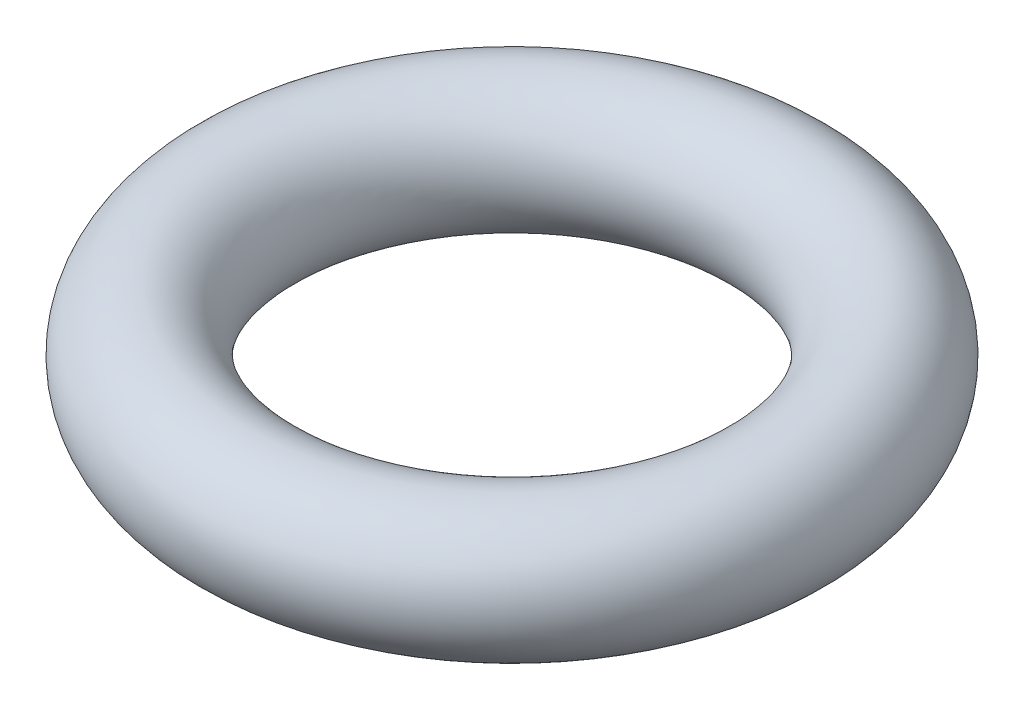
ISO-10303-21;
HEADER;
FILE_DESCRIPTION(('STEP AP214'),'2;1');
FILE_NAME('part.step','',(''),(''),'','','');
FILE_SCHEMA(('AUTOMOTIVE_DESIGN { 1 0 10303 214 1 1 1 1 }'));
ENDSEC;
DATA;
#1=APPLICATION_CONTEXT('core data for automotive mechanical design processes');
#2=APPLICATION_PROTOCOL_DEFINITION('international standard','automotive_design',2000,#1);
#3=PRODUCT_CONTEXT('',#1,'mechanical');
#4=PRODUCT('Part','Part','',(#3));
#5=PRODUCT_RELATED_PRODUCT_CATEGORY('part','',(#4));
#6=PRODUCT_DEFINITION_FORMATION('','',#4);
#7=PRODUCT_DEFINITION_CONTEXT('part definition',#1,'design');
#8=PRODUCT_DEFINITION('design','',#6,#7);
#9=PRODUCT_DEFINITION_SHAPE('','',#8);
#10=(LENGTH_UNIT() NAMED_UNIT(*) SI_UNIT(.MILLI.,.METRE.));
#11=(NAMED_UNIT(*) PLANE_ANGLE_UNIT() SI_UNIT($,.RADIAN.));
#12=(NAMED_UNIT(*) SI_UNIT($,.STERADIAN.) SOLID_ANGLE_UNIT());
#13=UNCERTAINTY_MEASURE_WITH_UNIT(LENGTH_MEASURE(1.E-05),#10,'distance_accuracy_value','');
#14=(GEOMETRIC_REPRESENTATION_CONTEXT(3) GLOBAL_UNCERTAINTY_ASSIGNED_CONTEXT((#13)) GLOBAL_UNIT_ASSIGNED_CONTEXT((#10,
#11,#12)) REPRESENTATION_CONTEXT('',''));
#15=CARTESIAN_POINT('',(0.,0.,0.));
#16=DIRECTION('',(0.,0.,1.));
#17=DIRECTION('',(1.,0.,0.));
#18=AXIS2_PLACEMENT_3D('',#15,#16,#17);
#19=CARTESIAN_POINT('',(0.,0.,0.));
#20=DIRECTION('',(0.,-1.,0.));
#21=DIRECTION('',(0.,0.,-1.));
#22=AXIS2_PLACEMENT_3D('',#19,#20,#21);
#23=TOROIDAL_SURFACE('',#22,3.175,0.79375);
#24=CARTESIAN_POINT('',(0.,0.,-3.96875));
#25=VERTEX_POINT('',#24);
#26=VERTEX_LOOP('',#25);
#27=FACE_BOUND('',#26,.T.);
#28=ADVANCED_FACE('F34',(#27),#23,.T.);
#29=CLOSED_SHELL('',(#28));
#30=MANIFOLD_SOLID_BREP('B2',#29);
#31=ADVANCED_BREP_SHAPE_REPRESENTATION('',(#18,#30),#14);
#32=SHAPE_DEFINITION_REPRESENTATION(#9,#31);
ENDSEC;
END-ISO-10303-21;
